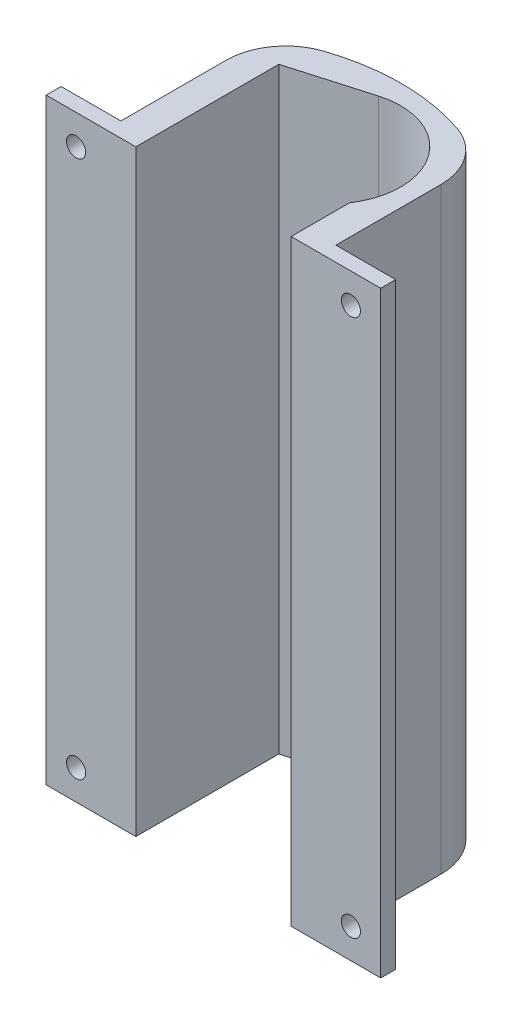
ISO-10303-21;
HEADER;
FILE_DESCRIPTION(('STEP AP214'),'2;1');
FILE_NAME('part.step','',(''),(''),'','','');
FILE_SCHEMA(('AUTOMOTIVE_DESIGN { 1 0 10303 214 1 1 1 1 }'));
ENDSEC;
DATA;
#1=APPLICATION_CONTEXT('core data for automotive mechanical design processes');
#2=APPLICATION_PROTOCOL_DEFINITION('international standard','automotive_design',2000,#1);
#3=PRODUCT_CONTEXT('',#1,'mechanical');
#4=PRODUCT('Part','Part','',(#3));
#5=PRODUCT_RELATED_PRODUCT_CATEGORY('part','',(#4));
#6=PRODUCT_DEFINITION_FORMATION('','',#4);
#7=PRODUCT_DEFINITION_CONTEXT('part definition',#1,'design');
#8=PRODUCT_DEFINITION('design','',#6,#7);
#9=PRODUCT_DEFINITION_SHAPE('','',#8);
#10=(LENGTH_UNIT() NAMED_UNIT(*) SI_UNIT(.MILLI.,.METRE.));
#11=(NAMED_UNIT(*) PLANE_ANGLE_UNIT() SI_UNIT($,.RADIAN.));
#12=(NAMED_UNIT(*) SI_UNIT($,.STERADIAN.) SOLID_ANGLE_UNIT());
#13=UNCERTAINTY_MEASURE_WITH_UNIT(LENGTH_MEASURE(1.E-05),#10,'distance_accuracy_value','');
#14=(GEOMETRIC_REPRESENTATION_CONTEXT(3) GLOBAL_UNCERTAINTY_ASSIGNED_CONTEXT((#13)) GLOBAL_UNIT_ASSIGNED_CONTEXT((#10,
#11,#12)) REPRESENTATION_CONTEXT('',''));
#15=CARTESIAN_POINT('',(0.,0.,0.));
#16=DIRECTION('',(0.,0.,1.));
#17=DIRECTION('',(1.,0.,0.));
#18=AXIS2_PLACEMENT_3D('',#15,#16,#17);
#19=CARTESIAN_POINT('',(0.,127.,74.9201803451045));
#20=DIRECTION('',(0.,-1.,0.));
#21=DIRECTION('',(0.,0.,-1.));
#22=AXIS2_PLACEMENT_3D('',#19,#20,#21);
#23=CYLINDRICAL_SURFACE('',#22,14.9862811380157);
#24=CARTESIAN_POINT('',(0.,0.,74.9201803451045));
#25=DIRECTION('',(0.,-1.,0.));
#26=DIRECTION('',(0.,0.,-1.));
#27=AXIS2_PLACEMENT_3D('',#24,#25,#26);
#28=CIRCLE('',#27,14.9862811380157);
#29=CARTESIAN_POINT('',(-4.16201958345776,0.,60.5234371253843));
#30=VERTEX_POINT('',#29);
#31=CARTESIAN_POINT('',(12.446,0.,83.2679768416446));
#32=VERTEX_POINT('',#31);
#33=EDGE_CURVE('E178',#30,#32,#28,.T.);
#34=ORIENTED_EDGE('',*,*,#33,.T.);
#35=DIRECTION('',(0.,-1.,0.));
#36=VECTOR('',#35,1.);
#37=CARTESIAN_POINT('',(12.446,127.,83.2679768416446));
#38=LINE('',#37,#36);
#39=CARTESIAN_POINT('',(12.446,127.,83.2679768416446));
#40=VERTEX_POINT('',#39);
#41=EDGE_CURVE('E158',#40,#32,#38,.T.);
#42=ORIENTED_EDGE('',*,*,#41,.F.);
#43=CARTESIAN_POINT('',(0.,127.,74.9201803451045));
#44=DIRECTION('',(0.,-1.,0.));
#45=DIRECTION('',(0.,0.,-1.));
#46=AXIS2_PLACEMENT_3D('',#43,#44,#45);
#47=CIRCLE('',#46,14.9862811380157);
#48=CARTESIAN_POINT('',(-4.16201958345776,127.,60.5234371253843));
#49=VERTEX_POINT('',#48);
#50=EDGE_CURVE('E165',#49,#40,#47,.T.);
#51=ORIENTED_EDGE('',*,*,#50,.F.);
#52=DIRECTION('',(0.,-1.,0.));
#53=VECTOR('',#52,1.);
#54=CARTESIAN_POINT('',(-4.16201958345776,127.,60.5234371253843));
#55=LINE('',#54,#53);
#56=EDGE_CURVE('E256',#49,#30,#55,.T.);
#57=ORIENTED_EDGE('',*,*,#56,.T.);
#58=EDGE_LOOP('',(#34,#42,#51,#57));
#59=FACE_BOUND('',#58,.T.);
#60=ADVANCED_FACE('F43',(#59),#23,.F.);
#61=CARTESIAN_POINT('',(12.446,127.,95.666893232235));
#62=DIRECTION('',(1.,0.,0.));
#63=DIRECTION('',(0.,0.,-1.));
#64=AXIS2_PLACEMENT_3D('',#61,#62,#63);
#65=PLANE('',#64);
#66=DIRECTION('',(0.,0.,1.));
#67=VECTOR('',#66,1.);
#68=CARTESIAN_POINT('',(12.446,0.,95.666893232235));
#69=LINE('',#68,#67);
#70=CARTESIAN_POINT('',(12.446,0.,95.666893232235));
#71=VERTEX_POINT('',#70);
#72=EDGE_CURVE('E298',#32,#71,#69,.T.);
#73=ORIENTED_EDGE('',*,*,#72,.T.);
#74=DIRECTION('',(0.,-1.,0.));
#75=VECTOR('',#74,1.);
#76=CARTESIAN_POINT('',(12.446,127.,95.666893232235));
#77=LINE('',#76,#75);
#78=CARTESIAN_POINT('',(12.446,127.,95.666893232235));
#79=VERTEX_POINT('',#78);
#80=EDGE_CURVE('E161',#79,#71,#77,.T.);
#81=ORIENTED_EDGE('',*,*,#80,.F.);
#82=DIRECTION('',(0.,0.,1.));
#83=VECTOR('',#82,1.);
#84=CARTESIAN_POINT('',(12.446,127.,95.666893232235));
#85=LINE('',#84,#83);
#86=EDGE_CURVE('E154',#40,#79,#85,.T.);
#87=ORIENTED_EDGE('',*,*,#86,.F.);
#88=ORIENTED_EDGE('',*,*,#41,.T.);
#89=EDGE_LOOP('',(#73,#81,#87,#88));
#90=FACE_BOUND('',#89,.T.);
#91=ADVANCED_FACE('F156',(#90),#65,.F.);
#92=CARTESIAN_POINT('',(12.446,127.,95.666893232235));
#93=DIRECTION('',(0.,0.,-1.));
#94=DIRECTION('',(-1.,0.,0.));
#95=AXIS2_PLACEMENT_3D('',#92,#93,#94);
#96=PLANE('',#95);
#97=CARTESIAN_POINT('',(25.146,6.35,95.666893232235));
#98=DIRECTION('',(0.,0.,-1.));
#99=DIRECTION('',(-1.,0.,0.));
#100=AXIS2_PLACEMENT_3D('',#97,#98,#99);
#101=CIRCLE('',#100,2.03200000000001);
#102=CARTESIAN_POINT('',(23.114,6.35,95.666893232235));
#103=VERTEX_POINT('',#102);
#104=EDGE_CURVE('E335',#103,#103,#101,.T.);
#105=ORIENTED_EDGE('',*,*,#104,.T.);
#106=EDGE_LOOP('',(#105));
#107=FACE_BOUND('',#106,.T.);
#108=CARTESIAN_POINT('',(25.146,120.65,95.666893232235));
#109=DIRECTION('',(0.,0.,-1.));
#110=DIRECTION('',(-1.,0.,0.));
#111=AXIS2_PLACEMENT_3D('',#108,#109,#110);
#112=CIRCLE('',#111,2.03200000000002);
#113=CARTESIAN_POINT('',(23.114,120.65,95.666893232235));
#114=VERTEX_POINT('',#113);
#115=EDGE_CURVE('E305',#114,#114,#112,.T.);
#116=ORIENTED_EDGE('',*,*,#115,.T.);
#117=EDGE_LOOP('',(#116));
#118=FACE_BOUND('',#117,.T.);
#119=DIRECTION('',(1.,0.,0.));
#120=VECTOR('',#119,1.);
#121=CARTESIAN_POINT('',(12.446,0.,95.666893232235));
#122=LINE('',#121,#120);
#123=CARTESIAN_POINT('',(31.496,0.,95.666893232235));
#124=VERTEX_POINT('',#123);
#125=EDGE_CURVE('E295',#71,#124,#122,.T.);
#126=ORIENTED_EDGE('',*,*,#125,.T.);
#127=DIRECTION('',(0.,-1.,0.));
#128=VECTOR('',#127,1.);
#129=CARTESIAN_POINT('',(31.496,127.,95.666893232235));
#130=LINE('',#129,#128);
#131=CARTESIAN_POINT('',(31.496,127.,95.666893232235));
#132=VERTEX_POINT('',#131);
#133=EDGE_CURVE('E186',#132,#124,#130,.T.);
#134=ORIENTED_EDGE('',*,*,#133,.F.);
#135=DIRECTION('',(1.,0.,0.));
#136=VECTOR('',#135,1.);
#137=CARTESIAN_POINT('',(12.446,127.,95.666893232235));
#138=LINE('',#137,#136);
#139=EDGE_CURVE('E164',#79,#132,#138,.T.);
#140=ORIENTED_EDGE('',*,*,#139,.F.);
#141=ORIENTED_EDGE('',*,*,#80,.T.);
#142=EDGE_LOOP('',(#126,#134,#140,#141));
#143=FACE_BOUND('',#142,.T.);
#144=ADVANCED_FACE('F409',(#107,#118,#143),#96,.F.);
#145=CARTESIAN_POINT('',(31.496,127.,95.666893232235));
#146=DIRECTION('',(-1.,0.,0.));
#147=DIRECTION('',(0.,0.,1.));
#148=AXIS2_PLACEMENT_3D('',#145,#146,#147);
#149=PLANE('',#148);
#150=DIRECTION('',(0.,0.,-1.));
#151=VECTOR('',#150,1.);
#152=CARTESIAN_POINT('',(31.496,0.,95.666893232235));
#153=LINE('',#152,#151);
#154=CARTESIAN_POINT('',(31.496,0.,92.491893232235));
#155=VERTEX_POINT('',#154);
#156=EDGE_CURVE('E235',#124,#155,#153,.T.);
#157=ORIENTED_EDGE('',*,*,#156,.T.);
#158=DIRECTION('',(0.,-1.,0.));
#159=VECTOR('',#158,1.);
#160=CARTESIAN_POINT('',(31.496,127.,92.491893232235));
#161=LINE('',#160,#159);
#162=CARTESIAN_POINT('',(31.496,127.,92.491893232235));
#163=VERTEX_POINT('',#162);
#164=EDGE_CURVE('E281',#163,#155,#161,.T.);
#165=ORIENTED_EDGE('',*,*,#164,.F.);
#166=DIRECTION('',(0.,0.,-1.));
#167=VECTOR('',#166,1.);
#168=CARTESIAN_POINT('',(31.496,127.,95.666893232235));
#169=LINE('',#168,#167);
#170=EDGE_CURVE('E292',#132,#163,#169,.T.);
#171=ORIENTED_EDGE('',*,*,#170,.F.);
#172=ORIENTED_EDGE('',*,*,#133,.T.);
#173=EDGE_LOOP('',(#157,#165,#171,#172));
#174=FACE_BOUND('',#173,.T.);
#175=ADVANCED_FACE('F290',(#174),#149,.F.);
#176=CARTESIAN_POINT('',(31.496,127.,92.491893232235));
#177=DIRECTION('',(0.,0.,1.));
#178=DIRECTION('',(1.,0.,0.));
#179=AXIS2_PLACEMENT_3D('',#176,#177,#178);
#180=PLANE('',#179);
#181=CARTESIAN_POINT('',(25.146,6.35,92.491893232235));
#182=DIRECTION('',(0.,0.,-1.));
#183=DIRECTION('',(-1.,0.,0.));
#184=AXIS2_PLACEMENT_3D('',#181,#182,#183);
#185=CIRCLE('',#184,2.03200000000001);
#186=CARTESIAN_POINT('',(23.114,6.35,92.491893232235));
#187=VERTEX_POINT('',#186);
#188=EDGE_CURVE('E348',#187,#187,#185,.T.);
#189=ORIENTED_EDGE('',*,*,#188,.F.);
#190=EDGE_LOOP('',(#189));
#191=FACE_BOUND('',#190,.T.);
#192=CARTESIAN_POINT('',(25.146,120.65,92.491893232235));
#193=DIRECTION('',(0.,0.,-1.));
#194=DIRECTION('',(-1.,0.,0.));
#195=AXIS2_PLACEMENT_3D('',#192,#193,#194);
#196=CIRCLE('',#195,2.03200000000002);
#197=CARTESIAN_POINT('',(23.114,120.65,92.491893232235));
#198=VERTEX_POINT('',#197);
#199=EDGE_CURVE('E331',#198,#198,#196,.T.);
#200=ORIENTED_EDGE('',*,*,#199,.F.);
#201=EDGE_LOOP('',(#200));
#202=FACE_BOUND('',#201,.T.);
#203=DIRECTION('',(-1.,0.,0.));
#204=VECTOR('',#203,1.);
#205=CARTESIAN_POINT('',(31.496,0.,92.491893232235));
#206=LINE('',#205,#204);
#207=CARTESIAN_POINT('',(18.796,0.,92.491893232235));
#208=VERTEX_POINT('',#207);
#209=EDGE_CURVE('E229',#155,#208,#206,.T.);
#210=ORIENTED_EDGE('',*,*,#209,.T.);
#211=DIRECTION('',(0.,-1.,0.));
#212=VECTOR('',#211,1.);
#213=CARTESIAN_POINT('',(18.796,127.,92.491893232235));
#214=LINE('',#213,#212);
#215=CARTESIAN_POINT('',(18.796,127.,92.491893232235));
#216=VERTEX_POINT('',#215);
#217=EDGE_CURVE('E227',#216,#208,#214,.T.);
#218=ORIENTED_EDGE('',*,*,#217,.F.);
#219=DIRECTION('',(-1.,0.,0.));
#220=VECTOR('',#219,1.);
#221=CARTESIAN_POINT('',(31.496,127.,92.491893232235));
#222=LINE('',#221,#220);
#223=EDGE_CURVE('E324',#163,#216,#222,.T.);
#224=ORIENTED_EDGE('',*,*,#223,.F.);
#225=ORIENTED_EDGE('',*,*,#164,.T.);
#226=EDGE_LOOP('',(#210,#218,#224,#225));
#227=FACE_BOUND('',#226,.T.);
#228=ADVANCED_FACE('F417',(#191,#202,#227),#180,.F.);
#229=CARTESIAN_POINT('',(18.796,127.,92.491893232235));
#230=DIRECTION('',(-1.,0.,0.));
#231=DIRECTION('',(0.,0.,1.));
#232=AXIS2_PLACEMENT_3D('',#229,#230,#231);
#233=PLANE('',#232);
#234=DIRECTION('',(0.,0.,-1.));
#235=VECTOR('',#234,1.);
#236=CARTESIAN_POINT('',(18.796,0.,92.491893232235));
#237=LINE('',#236,#235);
#238=CARTESIAN_POINT('',(18.796,0.,70.1337045539243));
#239=VERTEX_POINT('',#238);
#240=EDGE_CURVE('E222',#208,#239,#237,.T.);
#241=ORIENTED_EDGE('',*,*,#240,.T.);
#242=DIRECTION('',(0.,-1.,0.));
#243=VECTOR('',#242,1.);
#244=CARTESIAN_POINT('',(18.796,127.,70.1337045539243));
#245=LINE('',#244,#243);
#246=CARTESIAN_POINT('',(18.796,127.,70.1337045539243));
#247=VERTEX_POINT('',#246);
#248=EDGE_CURVE('E67',#239,#247,#245,.F.);
#249=ORIENTED_EDGE('',*,*,#248,.T.);
#250=DIRECTION('',(0.,0.,-1.));
#251=VECTOR('',#250,1.);
#252=CARTESIAN_POINT('',(18.796,127.,92.491893232235));
#253=LINE('',#252,#251);
#254=EDGE_CURVE('E206',#216,#247,#253,.T.);
#255=ORIENTED_EDGE('',*,*,#254,.F.);
#256=ORIENTED_EDGE('',*,*,#217,.T.);
#257=EDGE_LOOP('',(#241,#249,#255,#256));
#258=FACE_BOUND('',#257,.T.);
#259=ADVANCED_FACE('F225',(#258),#233,.F.);
#260=CARTESIAN_POINT('',(-4.064,127.,100.214211531035));
#261=DIRECTION('',(0.,-1.,0.));
#262=DIRECTION('',(0.,0.,-1.));
#263=AXIS2_PLACEMENT_3D('',#260,#261,#262);
#264=CYLINDRICAL_SURFACE('',#263,44.45);
#265=CARTESIAN_POINT('',(-4.064,127.,100.214211531035));
#266=DIRECTION('',(0.,1.,0.));
#267=DIRECTION('',(0.,0.,-1.));
#268=AXIS2_PLACEMENT_3D('',#265,#266,#267);
#269=CIRCLE('',#268,44.45);
#270=CARTESIAN_POINT('',(10.16,127.,58.1015017630801));
#271=VERTEX_POINT('',#270);
#272=CARTESIAN_POINT('',(-18.288,127.,58.1015017630801));
#273=VERTEX_POINT('',#272);
#274=EDGE_CURVE('E205',#271,#273,#269,.T.);
#275=ORIENTED_EDGE('',*,*,#274,.F.);
#276=DIRECTION('',(0.,-1.,0.));
#277=VECTOR('',#276,1.);
#278=CARTESIAN_POINT('',(10.16,127.,58.1015017630801));
#279=LINE('',#278,#277);
#280=CARTESIAN_POINT('',(10.16,0.,58.1015017630801));
#281=VERTEX_POINT('',#280);
#282=EDGE_CURVE('E184',#271,#281,#279,.T.);
#283=ORIENTED_EDGE('',*,*,#282,.T.);
#284=CARTESIAN_POINT('',(-4.064,0.,100.214211531035));
#285=DIRECTION('',(0.,1.,0.));
#286=DIRECTION('',(0.,0.,-1.));
#287=AXIS2_PLACEMENT_3D('',#284,#285,#286);
#288=CIRCLE('',#287,44.45);
#289=CARTESIAN_POINT('',(-18.288,0.,58.1015017630801));
#290=VERTEX_POINT('',#289);
#291=EDGE_CURVE('E223',#281,#290,#288,.T.);
#292=ORIENTED_EDGE('',*,*,#291,.T.);
#293=DIRECTION('',(0.,-1.,0.));
#294=VECTOR('',#293,1.);
#295=CARTESIAN_POINT('',(-18.288,127.,58.1015017630801));
#296=LINE('',#295,#294);
#297=EDGE_CURVE('E180',#290,#273,#296,.F.);
#298=ORIENTED_EDGE('',*,*,#297,.T.);
#299=EDGE_LOOP('',(#275,#283,#292,#298));
#300=FACE_BOUND('',#299,.T.);
#301=ADVANCED_FACE('F210',(#300),#264,.T.);
#302=CARTESIAN_POINT('',(-26.924,127.,92.491893232235));
#303=DIRECTION('',(1.,0.,0.));
#304=DIRECTION('',(0.,0.,-1.));
#305=AXIS2_PLACEMENT_3D('',#302,#303,#304);
#306=PLANE('',#305);
#307=DIRECTION('',(0.,0.,1.));
#308=VECTOR('',#307,1.);
#309=CARTESIAN_POINT('',(-26.924,127.,92.491893232235));
#310=LINE('',#309,#308);
#311=CARTESIAN_POINT('',(-26.924,127.,70.1337045539244));
#312=VERTEX_POINT('',#311);
#313=CARTESIAN_POINT('',(-26.924,127.,92.491893232235));
#314=VERTEX_POINT('',#313);
#315=EDGE_CURVE('E215',#312,#314,#310,.T.);
#316=ORIENTED_EDGE('',*,*,#315,.F.);
#317=DIRECTION('',(0.,-1.,0.));
#318=VECTOR('',#317,1.);
#319=CARTESIAN_POINT('',(-26.924,127.,70.1337045539244));
#320=LINE('',#319,#318);
#321=CARTESIAN_POINT('',(-26.924,0.,70.1337045539244));
#322=VERTEX_POINT('',#321);
#323=EDGE_CURVE('E11',#312,#322,#320,.T.);
#324=ORIENTED_EDGE('',*,*,#323,.T.);
#325=DIRECTION('',(0.,0.,1.));
#326=VECTOR('',#325,1.);
#327=CARTESIAN_POINT('',(-26.924,0.,92.491893232235));
#328=LINE('',#327,#326);
#329=CARTESIAN_POINT('',(-26.924,0.,92.491893232235));
#330=VERTEX_POINT('',#329);
#331=EDGE_CURVE('E233',#322,#330,#328,.T.);
#332=ORIENTED_EDGE('',*,*,#331,.T.);
#333=DIRECTION('',(0.,-1.,0.));
#334=VECTOR('',#333,1.);
#335=CARTESIAN_POINT('',(-26.924,127.,92.491893232235));
#336=LINE('',#335,#334);
#337=EDGE_CURVE('E275',#314,#330,#336,.T.);
#338=ORIENTED_EDGE('',*,*,#337,.F.);
#339=EDGE_LOOP('',(#316,#324,#332,#338));
#340=FACE_BOUND('',#339,.T.);
#341=ADVANCED_FACE('F377',(#340),#306,.F.);
#342=CARTESIAN_POINT('',(-39.624,127.,92.491893232235));
#343=DIRECTION('',(0.,0.,1.));
#344=DIRECTION('',(1.,0.,0.));
#345=AXIS2_PLACEMENT_3D('',#342,#343,#344);
#346=PLANE('',#345);
#347=CARTESIAN_POINT('',(-33.274,120.65,92.491893232235));
#348=DIRECTION('',(0.,0.,-1.));
#349=DIRECTION('',(-1.,0.,0.));
#350=AXIS2_PLACEMENT_3D('',#347,#348,#349);
#351=CIRCLE('',#350,2.03200000000002);
#352=CARTESIAN_POINT('',(-35.306,120.65,92.491893232235));
#353=VERTEX_POINT('',#352);
#354=EDGE_CURVE('E339',#353,#353,#351,.T.);
#355=ORIENTED_EDGE('',*,*,#354,.F.);
#356=EDGE_LOOP('',(#355));
#357=FACE_BOUND('',#356,.T.);
#358=CARTESIAN_POINT('',(-33.2739999999999,6.35000000000002,92.491893232235));
#359=DIRECTION('',(0.,0.,-1.));
#360=DIRECTION('',(-1.,0.,0.));
#361=AXIS2_PLACEMENT_3D('',#358,#359,#360);
#362=CIRCLE('',#361,2.03200000000001);
#363=CARTESIAN_POINT('',(-35.3059999999999,6.35000000000002,92.491893232235));
#364=VERTEX_POINT('',#363);
#365=EDGE_CURVE('E355',#364,#364,#362,.T.);
#366=ORIENTED_EDGE('',*,*,#365,.F.);
#367=EDGE_LOOP('',(#366));
#368=FACE_BOUND('',#367,.T.);
#369=DIRECTION('',(-1.,0.,0.));
#370=VECTOR('',#369,1.);
#371=CARTESIAN_POINT('',(-39.624,0.,92.491893232235));
#372=LINE('',#371,#370);
#373=CARTESIAN_POINT('',(-39.624,0.,92.491893232235));
#374=VERTEX_POINT('',#373);
#375=EDGE_CURVE('E241',#330,#374,#372,.T.);
#376=ORIENTED_EDGE('',*,*,#375,.T.);
#377=DIRECTION('',(0.,-1.,0.));
#378=VECTOR('',#377,1.);
#379=CARTESIAN_POINT('',(-39.624,127.,92.491893232235));
#380=LINE('',#379,#378);
#381=CARTESIAN_POINT('',(-39.624,127.,92.491893232235));
#382=VERTEX_POINT('',#381);
#383=EDGE_CURVE('E271',#382,#374,#380,.T.);
#384=ORIENTED_EDGE('',*,*,#383,.F.);
#385=DIRECTION('',(-1.,0.,0.));
#386=VECTOR('',#385,1.);
#387=CARTESIAN_POINT('',(-39.624,127.,92.491893232235));
#388=LINE('',#387,#386);
#389=EDGE_CURVE('E317',#314,#382,#388,.T.);
#390=ORIENTED_EDGE('',*,*,#389,.F.);
#391=ORIENTED_EDGE('',*,*,#337,.T.);
#392=EDGE_LOOP('',(#376,#384,#390,#391));
#393=FACE_BOUND('',#392,.T.);
#394=ADVANCED_FACE('F373',(#357,#368,#393),#346,.F.);
#395=CARTESIAN_POINT('',(-39.624,127.,95.666893232235));
#396=DIRECTION('',(1.,0.,0.));
#397=DIRECTION('',(0.,0.,-1.));
#398=AXIS2_PLACEMENT_3D('',#395,#396,#397);
#399=PLANE('',#398);
#400=DIRECTION('',(0.,0.,1.));
#401=VECTOR('',#400,1.);
#402=CARTESIAN_POINT('',(-39.624,0.,95.666893232235));
#403=LINE('',#402,#401);
#404=CARTESIAN_POINT('',(-39.624,0.,95.666893232235));
#405=VERTEX_POINT('',#404);
#406=EDGE_CURVE('E244',#374,#405,#403,.T.);
#407=ORIENTED_EDGE('',*,*,#406,.T.);
#408=DIRECTION('',(0.,-1.,0.));
#409=VECTOR('',#408,1.);
#410=CARTESIAN_POINT('',(-39.624,127.,95.666893232235));
#411=LINE('',#410,#409);
#412=CARTESIAN_POINT('',(-39.624,127.,95.666893232235));
#413=VERTEX_POINT('',#412);
#414=EDGE_CURVE('E267',#413,#405,#411,.T.);
#415=ORIENTED_EDGE('',*,*,#414,.F.);
#416=DIRECTION('',(0.,0.,1.));
#417=VECTOR('',#416,1.);
#418=CARTESIAN_POINT('',(-39.624,127.,95.666893232235));
#419=LINE('',#418,#417);
#420=EDGE_CURVE('E314',#382,#413,#419,.T.);
#421=ORIENTED_EDGE('',*,*,#420,.F.);
#422=ORIENTED_EDGE('',*,*,#383,.T.);
#423=EDGE_LOOP('',(#407,#415,#421,#422));
#424=FACE_BOUND('',#423,.T.);
#425=ADVANCED_FACE('F376',(#424),#399,.F.);
#426=CARTESIAN_POINT('',(-39.624,127.,95.666893232235));
#427=DIRECTION('',(0.,0.,-1.));
#428=DIRECTION('',(-1.,0.,0.));
#429=AXIS2_PLACEMENT_3D('',#426,#427,#428);
#430=PLANE('',#429);
#431=CARTESIAN_POINT('',(-33.274,120.65,95.666893232235));
#432=DIRECTION('',(0.,0.,-1.));
#433=DIRECTION('',(-1.,0.,0.));
#434=AXIS2_PLACEMENT_3D('',#431,#432,#433);
#435=CIRCLE('',#434,2.03200000000002);
#436=CARTESIAN_POINT('',(-35.306,120.65,95.666893232235));
#437=VERTEX_POINT('',#436);
#438=EDGE_CURVE('E343',#437,#437,#435,.T.);
#439=ORIENTED_EDGE('',*,*,#438,.T.);
#440=EDGE_LOOP('',(#439));
#441=FACE_BOUND('',#440,.T.);
#442=CARTESIAN_POINT('',(-33.2739999999999,6.35000000000002,95.666893232235));
#443=DIRECTION('',(0.,0.,-1.));
#444=DIRECTION('',(-1.,0.,0.));
#445=AXIS2_PLACEMENT_3D('',#442,#443,#444);
#446=CIRCLE('',#445,2.03200000000001);
#447=CARTESIAN_POINT('',(-35.3059999999999,6.35000000000002,95.666893232235));
#448=VERTEX_POINT('',#447);
#449=EDGE_CURVE('E344',#448,#448,#446,.T.);
#450=ORIENTED_EDGE('',*,*,#449,.T.);
#451=EDGE_LOOP('',(#450));
#452=FACE_BOUND('',#451,.T.);
#453=DIRECTION('',(1.,0.,0.));
#454=VECTOR('',#453,1.);
#455=CARTESIAN_POINT('',(-39.624,0.,95.666893232235));
#456=LINE('',#455,#454);
#457=CARTESIAN_POINT('',(-20.574,0.,95.666893232235));
#458=VERTEX_POINT('',#457);
#459=EDGE_CURVE('E247',#405,#458,#456,.T.);
#460=ORIENTED_EDGE('',*,*,#459,.T.);
#461=DIRECTION('',(0.,-1.,0.));
#462=VECTOR('',#461,1.);
#463=CARTESIAN_POINT('',(-20.574,127.,95.666893232235));
#464=LINE('',#463,#462);
#465=CARTESIAN_POINT('',(-20.574,127.,95.666893232235));
#466=VERTEX_POINT('',#465);
#467=EDGE_CURVE('E263',#466,#458,#464,.T.);
#468=ORIENTED_EDGE('',*,*,#467,.F.);
#469=DIRECTION('',(1.,0.,0.));
#470=VECTOR('',#469,1.);
#471=CARTESIAN_POINT('',(-39.624,127.,95.666893232235));
#472=LINE('',#471,#470);
#473=EDGE_CURVE('E311',#413,#466,#472,.T.);
#474=ORIENTED_EDGE('',*,*,#473,.F.);
#475=ORIENTED_EDGE('',*,*,#414,.T.);
#476=EDGE_LOOP('',(#460,#468,#474,#475));
#477=FACE_BOUND('',#476,.T.);
#478=ADVANCED_FACE('F363',(#441,#452,#477),#430,.F.);
#479=CARTESIAN_POINT('',(-20.574,127.,84.5721803451045));
#480=DIRECTION('',(-1.,0.,0.));
#481=DIRECTION('',(0.,0.,1.));
#482=AXIS2_PLACEMENT_3D('',#479,#480,#481);
#483=PLANE('',#482);
#484=DIRECTION('',(0.,0.,-1.));
#485=VECTOR('',#484,1.);
#486=CARTESIAN_POINT('',(-20.574,0.,84.5721803451045));
#487=LINE('',#486,#485);
#488=CARTESIAN_POINT('',(-20.574,0.,65.2680507407337));
#489=VERTEX_POINT('',#488);
#490=EDGE_CURVE('E251',#458,#489,#487,.T.);
#491=ORIENTED_EDGE('',*,*,#490,.T.);
#492=DIRECTION('',(0.,-1.,0.));
#493=VECTOR('',#492,1.);
#494=CARTESIAN_POINT('',(-20.574,127.,65.2680507407337));
#495=LINE('',#494,#493);
#496=CARTESIAN_POINT('',(-20.574,127.,65.2680507407337));
#497=VERTEX_POINT('',#496);
#498=EDGE_CURVE('E259',#497,#489,#495,.T.);
#499=ORIENTED_EDGE('',*,*,#498,.F.);
#500=DIRECTION('',(0.,0.,-1.));
#501=VECTOR('',#500,1.);
#502=CARTESIAN_POINT('',(-20.574,127.,84.5721803451045));
#503=LINE('',#502,#501);
#504=EDGE_CURVE('E308',#466,#497,#503,.T.);
#505=ORIENTED_EDGE('',*,*,#504,.F.);
#506=ORIENTED_EDGE('',*,*,#467,.T.);
#507=EDGE_LOOP('',(#491,#499,#505,#506));
#508=FACE_BOUND('',#507,.T.);
#509=ADVANCED_FACE('F395',(#508),#483,.F.);
#510=CARTESIAN_POINT('',(-20.574,127.,65.2680507407337));
#511=DIRECTION('',(-0.27772197419278,0.,-0.960661493477523));
#512=DIRECTION('',(-0.960661493477523,0.,0.27772197419278));
#513=AXIS2_PLACEMENT_3D('',#510,#511,#512);
#514=PLANE('',#513);
#515=DIRECTION('',(0.960661493477523,0.,-0.27772197419278));
#516=VECTOR('',#515,1.);
#517=CARTESIAN_POINT('',(-20.574,0.,65.2680507407337));
#518=LINE('',#517,#516);
#519=EDGE_CURVE('E175',#489,#30,#518,.T.);
#520=ORIENTED_EDGE('',*,*,#519,.T.);
#521=ORIENTED_EDGE('',*,*,#56,.F.);
#522=DIRECTION('',(0.960661493477523,0.,-0.27772197419278));
#523=VECTOR('',#522,1.);
#524=CARTESIAN_POINT('',(-20.574,127.,65.2680507407337));
#525=LINE('',#524,#523);
#526=EDGE_CURVE('E170',#497,#49,#525,.T.);
#527=ORIENTED_EDGE('',*,*,#526,.F.);
#528=ORIENTED_EDGE('',*,*,#498,.T.);
#529=EDGE_LOOP('',(#520,#521,#527,#528));
#530=FACE_BOUND('',#529,.T.);
#531=ADVANCED_FACE('F434',(#530),#514,.F.);
#532=CARTESIAN_POINT('',(0.,127.,74.9201803451045));
#533=DIRECTION('',(0.,-1.,0.));
#534=DIRECTION('',(0.,0.,-1.));
#535=AXIS2_PLACEMENT_3D('',#532,#533,#534);
#536=PLANE('',#535);
#537=ORIENTED_EDGE('',*,*,#254,.T.);
#538=CARTESIAN_POINT('',(6.09599999999999,127.,70.1337045539243));
#539=DIRECTION('',(0.,-1.,0.));
#540=DIRECTION('',(0.,0.,-1.));
#541=AXIS2_PLACEMENT_3D('',#538,#539,#540);
#542=CIRCLE('',#541,12.7);
#543=EDGE_CURVE('E52',#247,#271,#542,.F.);
#544=ORIENTED_EDGE('',*,*,#543,.T.);
#545=ORIENTED_EDGE('',*,*,#274,.T.);
#546=CARTESIAN_POINT('',(-14.224,127.,70.1337045539244));
#547=DIRECTION('',(0.,-1.,0.));
#548=DIRECTION('',(0.,0.,-1.));
#549=AXIS2_PLACEMENT_3D('',#546,#547,#548);
#550=CIRCLE('',#549,12.7);
#551=EDGE_CURVE('E59',#273,#312,#550,.F.);
#552=ORIENTED_EDGE('',*,*,#551,.T.);
#553=ORIENTED_EDGE('',*,*,#315,.T.);
#554=ORIENTED_EDGE('',*,*,#389,.T.);
#555=ORIENTED_EDGE('',*,*,#420,.T.);
#556=ORIENTED_EDGE('',*,*,#473,.T.);
#557=ORIENTED_EDGE('',*,*,#504,.T.);
#558=ORIENTED_EDGE('',*,*,#526,.T.);
#559=ORIENTED_EDGE('',*,*,#50,.T.);
#560=ORIENTED_EDGE('',*,*,#86,.T.);
#561=ORIENTED_EDGE('',*,*,#139,.T.);
#562=ORIENTED_EDGE('',*,*,#170,.T.);
#563=ORIENTED_EDGE('',*,*,#223,.T.);
#564=EDGE_LOOP('',(#537,#544,#545,#552,#553,#554,#555,#556,#557,#558,#559,#560,#561,#562,#563));
#565=FACE_BOUND('',#564,.T.);
#566=ADVANCED_FACE('F168',(#565),#536,.F.);
#567=CARTESIAN_POINT('',(0.,0.,74.9201803451045));
#568=DIRECTION('',(0.,-1.,0.));
#569=DIRECTION('',(0.,0.,-1.));
#570=AXIS2_PLACEMENT_3D('',#567,#568,#569);
#571=PLANE('',#570);
#572=ORIENTED_EDGE('',*,*,#291,.F.);
#573=CARTESIAN_POINT('',(6.09599999999999,0.,70.1337045539243));
#574=DIRECTION('',(0.,-1.,0.));
#575=DIRECTION('',(0.,0.,-1.));
#576=AXIS2_PLACEMENT_3D('',#573,#574,#575);
#577=CIRCLE('',#576,12.7);
#578=EDGE_CURVE('E196',#281,#239,#577,.T.);
#579=ORIENTED_EDGE('',*,*,#578,.T.);
#580=ORIENTED_EDGE('',*,*,#240,.F.);
#581=ORIENTED_EDGE('',*,*,#209,.F.);
#582=ORIENTED_EDGE('',*,*,#156,.F.);
#583=ORIENTED_EDGE('',*,*,#125,.F.);
#584=ORIENTED_EDGE('',*,*,#72,.F.);
#585=ORIENTED_EDGE('',*,*,#33,.F.);
#586=ORIENTED_EDGE('',*,*,#519,.F.);
#587=ORIENTED_EDGE('',*,*,#490,.F.);
#588=ORIENTED_EDGE('',*,*,#459,.F.);
#589=ORIENTED_EDGE('',*,*,#406,.F.);
#590=ORIENTED_EDGE('',*,*,#375,.F.);
#591=ORIENTED_EDGE('',*,*,#331,.F.);
#592=CARTESIAN_POINT('',(-14.224,0.,70.1337045539244));
#593=DIRECTION('',(0.,-1.,0.));
#594=DIRECTION('',(0.,0.,-1.));
#595=AXIS2_PLACEMENT_3D('',#592,#593,#594);
#596=CIRCLE('',#595,12.7);
#597=EDGE_CURVE('E193',#322,#290,#596,.T.);
#598=ORIENTED_EDGE('',*,*,#597,.T.);
#599=EDGE_LOOP('',(#572,#579,#580,#581,#582,#583,#584,#585,#586,#587,#588,#589,#590,#591,#598));
#600=FACE_BOUND('',#599,.T.);
#601=ADVANCED_FACE('F220',(#600),#571,.T.);
#602=CARTESIAN_POINT('',(6.09599999999999,127.,70.1337045539243));
#603=DIRECTION('',(0.,-1.,0.));
#604=DIRECTION('',(0.,0.,-1.));
#605=AXIS2_PLACEMENT_3D('',#602,#603,#604);
#606=CYLINDRICAL_SURFACE('',#605,12.7);
#607=ORIENTED_EDGE('',*,*,#543,.F.);
#608=ORIENTED_EDGE('',*,*,#248,.F.);
#609=ORIENTED_EDGE('',*,*,#578,.F.);
#610=ORIENTED_EDGE('',*,*,#282,.F.);
#611=EDGE_LOOP('',(#607,#608,#609,#610));
#612=FACE_BOUND('',#611,.T.);
#613=ADVANCED_FACE('F217',(#612),#606,.T.);
#614=CARTESIAN_POINT('',(-14.224,127.,70.1337045539244));
#615=DIRECTION('',(0.,-1.,0.));
#616=DIRECTION('',(0.,0.,-1.));
#617=AXIS2_PLACEMENT_3D('',#614,#615,#616);
#618=CYLINDRICAL_SURFACE('',#617,12.7);
#619=ORIENTED_EDGE('',*,*,#551,.F.);
#620=ORIENTED_EDGE('',*,*,#297,.F.);
#621=ORIENTED_EDGE('',*,*,#597,.F.);
#622=ORIENTED_EDGE('',*,*,#323,.F.);
#623=EDGE_LOOP('',(#619,#620,#621,#622));
#624=FACE_BOUND('',#623,.T.);
#625=ADVANCED_FACE('F45',(#624),#618,.T.);
#626=CARTESIAN_POINT('',(-33.2739999999999,6.35000000000002,95.666893232235));
#627=DIRECTION('',(0.,0.,-1.));
#628=DIRECTION('',(-1.,0.,0.));
#629=AXIS2_PLACEMENT_3D('',#626,#627,#628);
#630=CYLINDRICAL_SURFACE('',#629,2.03200000000001);
#631=ORIENTED_EDGE('',*,*,#449,.F.);
#632=EDGE_LOOP('',(#631));
#633=FACE_BOUND('',#632,.T.);
#634=ORIENTED_EDGE('',*,*,#365,.T.);
#635=EDGE_LOOP('',(#634));
#636=FACE_BOUND('',#635,.T.);
#637=ADVANCED_FACE('F366',(#633,#636),#630,.F.);
#638=CARTESIAN_POINT('',(-33.274,120.65,95.666893232235));
#639=DIRECTION('',(0.,0.,-1.));
#640=DIRECTION('',(-1.,0.,0.));
#641=AXIS2_PLACEMENT_3D('',#638,#639,#640);
#642=CYLINDRICAL_SURFACE('',#641,2.03200000000002);
#643=ORIENTED_EDGE('',*,*,#438,.F.);
#644=EDGE_LOOP('',(#643));
#645=FACE_BOUND('',#644,.T.);
#646=ORIENTED_EDGE('',*,*,#354,.T.);
#647=EDGE_LOOP('',(#646));
#648=FACE_BOUND('',#647,.T.);
#649=ADVANCED_FACE('F369',(#645,#648),#642,.F.);
#650=CARTESIAN_POINT('',(25.146,120.65,95.666893232235));
#651=DIRECTION('',(0.,0.,-1.));
#652=DIRECTION('',(-1.,0.,0.));
#653=AXIS2_PLACEMENT_3D('',#650,#651,#652);
#654=CYLINDRICAL_SURFACE('',#653,2.03200000000002);
#655=ORIENTED_EDGE('',*,*,#115,.F.);
#656=EDGE_LOOP('',(#655));
#657=FACE_BOUND('',#656,.T.);
#658=ORIENTED_EDGE('',*,*,#199,.T.);
#659=EDGE_LOOP('',(#658));
#660=FACE_BOUND('',#659,.T.);
#661=ADVANCED_FACE('F442',(#657,#660),#654,.F.);
#662=CARTESIAN_POINT('',(25.146,6.35,95.666893232235));
#663=DIRECTION('',(0.,0.,-1.));
#664=DIRECTION('',(-1.,0.,0.));
#665=AXIS2_PLACEMENT_3D('',#662,#663,#664);
#666=CYLINDRICAL_SURFACE('',#665,2.03200000000001);
#667=ORIENTED_EDGE('',*,*,#104,.F.);
#668=EDGE_LOOP('',(#667));
#669=FACE_BOUND('',#668,.T.);
#670=ORIENTED_EDGE('',*,*,#188,.T.);
#671=EDGE_LOOP('',(#670));
#672=FACE_BOUND('',#671,.T.);
#673=ADVANCED_FACE('F445',(#669,#672),#666,.F.);
#674=CLOSED_SHELL('',(#60,#91,#144,#175,#228,#259,#301,#341,#394,#425,#478,#509,#531,#566,#601,
#613,#625,#637,#649,#661,#673));
#675=MANIFOLD_SOLID_BREP('B2',#674);
#676=ADVANCED_BREP_SHAPE_REPRESENTATION('',(#18,#675),#14);
#677=SHAPE_DEFINITION_REPRESENTATION(#9,#676);
ENDSEC;
END-ISO-10303-21;
